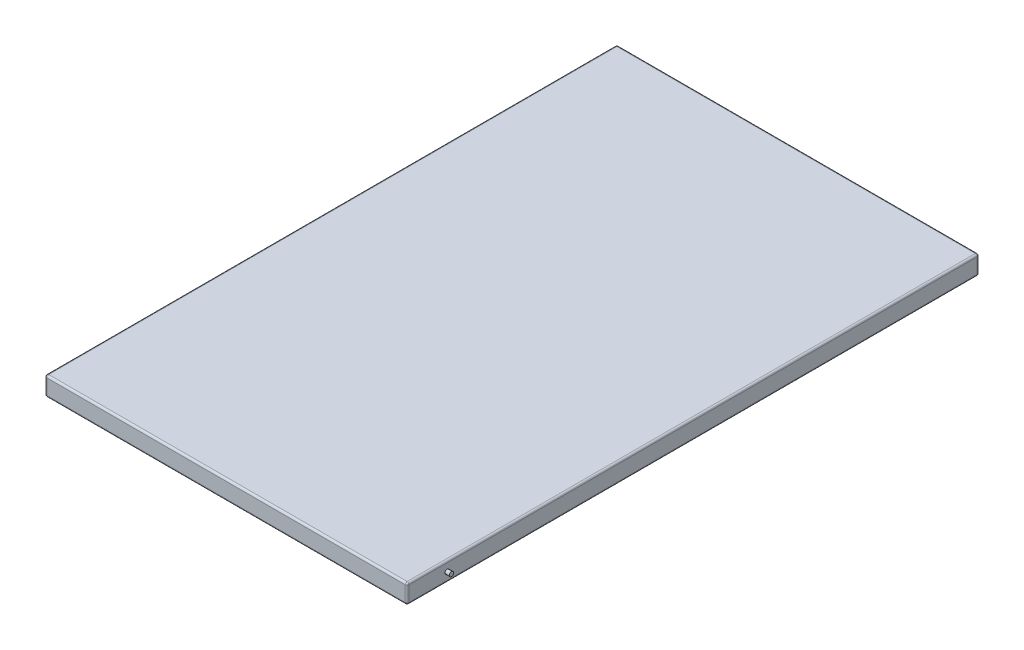
ISO-10303-21;
HEADER;
FILE_DESCRIPTION(('STEP AP214'),'2;1');
FILE_NAME('part.step','',(''),(''),'','','');
FILE_SCHEMA(('AUTOMOTIVE_DESIGN { 1 0 10303 214 1 1 1 1 }'));
ENDSEC;
DATA;
#1=APPLICATION_CONTEXT('core data for automotive mechanical design processes');
#2=APPLICATION_PROTOCOL_DEFINITION('international standard','automotive_design',2000,#1);
#3=PRODUCT_CONTEXT('',#1,'mechanical');
#4=PRODUCT('Part','Part','',(#3));
#5=PRODUCT_RELATED_PRODUCT_CATEGORY('part','',(#4));
#6=PRODUCT_DEFINITION_FORMATION('','',#4);
#7=PRODUCT_DEFINITION_CONTEXT('part definition',#1,'design');
#8=PRODUCT_DEFINITION('design','',#6,#7);
#9=PRODUCT_DEFINITION_SHAPE('','',#8);
#10=(LENGTH_UNIT() NAMED_UNIT(*) SI_UNIT(.MILLI.,.METRE.));
#11=(NAMED_UNIT(*) PLANE_ANGLE_UNIT() SI_UNIT($,.RADIAN.));
#12=(NAMED_UNIT(*) SI_UNIT($,.STERADIAN.) SOLID_ANGLE_UNIT());
#13=UNCERTAINTY_MEASURE_WITH_UNIT(LENGTH_MEASURE(1.E-05),#10,'distance_accuracy_value','');
#14=(GEOMETRIC_REPRESENTATION_CONTEXT(3) GLOBAL_UNCERTAINTY_ASSIGNED_CONTEXT((#13)) GLOBAL_UNIT_ASSIGNED_CONTEXT((#10,
#11,#12)) REPRESENTATION_CONTEXT('',''));
#15=CARTESIAN_POINT('',(0.,0.,0.));
#16=DIRECTION('',(0.,0.,1.));
#17=DIRECTION('',(1.,0.,0.));
#18=AXIS2_PLACEMENT_3D('',#15,#16,#17);
#19=CARTESIAN_POINT('',(-189.999999999999,20.0000000000006,-600.000000000021));
#20=DIRECTION('',(-1.,0.,0.));
#21=DIRECTION('',(0.,0.,1.00000000000004));
#22=AXIS2_PLACEMENT_3D('',#19,#20,#21);
#23=PLANE('',#22);
#24=DIRECTION('',(0.,0.,1.00000000000004));
#25=VECTOR('',#24,1.);
#26=CARTESIAN_POINT('',(-189.999999999999,18.0000000000006,-600.000000000021));
#27=LINE('',#26,#25);
#28=CARTESIAN_POINT('',(-190.,18.0000000000006,-2.));
#29=VERTEX_POINT('',#28);
#30=CARTESIAN_POINT('',(-189.999999999999,18.0000000000006,-598.000000000021));
#31=VERTEX_POINT('',#30);
#32=EDGE_CURVE('E232',#29,#31,#27,.F.);
#33=ORIENTED_EDGE('',*,*,#32,.T.);
#34=DIRECTION('',(0.,-1.00000000000004,0.));
#35=VECTOR('',#34,1.);
#36=CARTESIAN_POINT('',(-189.999999999999,1.66533453693773E-13,-598.000000000021));
#37=LINE('',#36,#35);
#38=CARTESIAN_POINT('',(-189.999999999999,2.00000000000017,-598.000000000021));
#39=VERTEX_POINT('',#38);
#40=EDGE_CURVE('E235',#31,#39,#37,.T.);
#41=ORIENTED_EDGE('',*,*,#40,.T.);
#42=DIRECTION('',(0.,0.,1.00000000000004));
#43=VECTOR('',#42,1.);
#44=CARTESIAN_POINT('',(-189.999999999999,2.00000000000017,-600.000000000021));
#45=LINE('',#44,#43);
#46=CARTESIAN_POINT('',(-190.,2.00000000000017,-2.));
#47=VERTEX_POINT('',#46);
#48=EDGE_CURVE('E216',#39,#47,#45,.T.);
#49=ORIENTED_EDGE('',*,*,#48,.T.);
#50=DIRECTION('',(0.,-1.00000000000004,0.));
#51=VECTOR('',#50,1.);
#52=CARTESIAN_POINT('',(-190.,20.0000000000006,-2.));
#53=LINE('',#52,#51);
#54=EDGE_CURVE('E225',#47,#29,#53,.F.);
#55=ORIENTED_EDGE('',*,*,#54,.T.);
#56=EDGE_LOOP('',(#33,#41,#49,#55));
#57=FACE_BOUND('',#56,.T.);
#58=ADVANCED_FACE('F36',(#57),#23,.T.);
#59=CARTESIAN_POINT('',(190.000000000001,20.0000000000007,-600.000000000021));
#60=DIRECTION('',(0.,1.00000000000004,0.));
#61=DIRECTION('',(-1.,0.,0.));
#62=AXIS2_PLACEMENT_3D('',#59,#60,#61);
#63=PLANE('',#62);
#64=DIRECTION('',(0.,0.,1.00000000000004));
#65=VECTOR('',#64,1.);
#66=CARTESIAN_POINT('',(188.000000000001,20.0000000000007,-600.000000000021));
#67=LINE('',#66,#65);
#68=CARTESIAN_POINT('',(188.,20.0000000000007,-2.));
#69=VERTEX_POINT('',#68);
#70=CARTESIAN_POINT('',(188.000000000001,20.0000000000007,-598.000000000021));
#71=VERTEX_POINT('',#70);
#72=EDGE_CURVE('E159',#69,#71,#67,.F.);
#73=ORIENTED_EDGE('',*,*,#72,.T.);
#74=DIRECTION('',(-1.,0.,0.));
#75=VECTOR('',#74,1.);
#76=CARTESIAN_POINT('',(-189.999999999999,20.0000000000006,-598.000000000021));
#77=LINE('',#76,#75);
#78=CARTESIAN_POINT('',(-187.999999999999,20.0000000000006,-598.000000000021));
#79=VERTEX_POINT('',#78);
#80=EDGE_CURVE('E242',#71,#79,#77,.T.);
#81=ORIENTED_EDGE('',*,*,#80,.T.);
#82=DIRECTION('',(0.,0.,1.00000000000004));
#83=VECTOR('',#82,1.);
#84=CARTESIAN_POINT('',(-187.999999999999,20.0000000000006,-600.000000000021));
#85=LINE('',#84,#83);
#86=CARTESIAN_POINT('',(-188.,20.0000000000006,-2.));
#87=VERTEX_POINT('',#86);
#88=EDGE_CURVE('E240',#79,#87,#85,.T.);
#89=ORIENTED_EDGE('',*,*,#88,.T.);
#90=DIRECTION('',(-1.,0.,0.));
#91=VECTOR('',#90,1.);
#92=CARTESIAN_POINT('',(190.,20.0000000000007,-2.));
#93=LINE('',#92,#91);
#94=EDGE_CURVE('E238',#87,#69,#93,.F.);
#95=ORIENTED_EDGE('',*,*,#94,.T.);
#96=EDGE_LOOP('',(#73,#81,#89,#95));
#97=FACE_BOUND('',#96,.T.);
#98=ADVANCED_FACE('F309',(#97),#63,.T.);
#99=CARTESIAN_POINT('',(190.000000000001,0.,-600.000000000021));
#100=DIRECTION('',(1.,0.,0.));
#101=DIRECTION('',(0.,0.,-1.00000000000004));
#102=AXIS2_PLACEMENT_3D('',#99,#100,#101);
#103=PLANE('',#102);
#104=CARTESIAN_POINT('',(190.,10.0000000000003,-42.0000000000007));
#105=DIRECTION('',(1.,0.,0.));
#106=DIRECTION('',(0.,0.,-1.00000000000004));
#107=AXIS2_PLACEMENT_3D('',#104,#105,#106);
#108=CIRCLE('',#107,2.25);
#109=CARTESIAN_POINT('',(190.,10.0000000000003,-44.2500000000008));
#110=VERTEX_POINT('',#109);
#111=EDGE_CURVE('E292',#110,#110,#108,.T.);
#112=ORIENTED_EDGE('',*,*,#111,.F.);
#113=EDGE_LOOP('',(#112));
#114=FACE_BOUND('',#113,.T.);
#115=DIRECTION('',(0.,0.,1.00000000000004));
#116=VECTOR('',#115,1.);
#117=CARTESIAN_POINT('',(190.000000000001,2.,-600.000000000021));
#118=LINE('',#117,#116);
#119=CARTESIAN_POINT('',(190.,2.,-2.));
#120=VERTEX_POINT('',#119);
#121=CARTESIAN_POINT('',(190.000000000001,2.,-598.000000000021));
#122=VERTEX_POINT('',#121);
#123=EDGE_CURVE('E137',#120,#122,#118,.F.);
#124=ORIENTED_EDGE('',*,*,#123,.T.);
#125=DIRECTION('',(0.,1.00000000000004,0.));
#126=VECTOR('',#125,1.);
#127=CARTESIAN_POINT('',(190.000000000001,20.0000000000007,-598.000000000021));
#128=LINE('',#127,#126);
#129=CARTESIAN_POINT('',(190.000000000001,18.0000000000007,-598.000000000021));
#130=VERTEX_POINT('',#129);
#131=EDGE_CURVE('E133',#122,#130,#128,.T.);
#132=ORIENTED_EDGE('',*,*,#131,.T.);
#133=DIRECTION('',(0.,0.,1.00000000000004));
#134=VECTOR('',#133,1.);
#135=CARTESIAN_POINT('',(190.000000000001,18.0000000000007,-600.000000000021));
#136=LINE('',#135,#134);
#137=CARTESIAN_POINT('',(190.,18.0000000000007,-2.));
#138=VERTEX_POINT('',#137);
#139=EDGE_CURVE('E127',#130,#138,#136,.T.);
#140=ORIENTED_EDGE('',*,*,#139,.T.);
#141=DIRECTION('',(0.,1.00000000000004,0.));
#142=VECTOR('',#141,1.);
#143=CARTESIAN_POINT('',(190.,0.,-2.));
#144=LINE('',#143,#142);
#145=EDGE_CURVE('E130',#138,#120,#144,.F.);
#146=ORIENTED_EDGE('',*,*,#145,.T.);
#147=EDGE_LOOP('',(#124,#132,#140,#146));
#148=FACE_BOUND('',#147,.T.);
#149=ADVANCED_FACE('F129',(#114,#148),#103,.T.);
#150=CARTESIAN_POINT('',(-189.999999999999,1.66533453693773E-13,-600.000000000021));
#151=DIRECTION('',(0.,-1.00000000000004,0.));
#152=DIRECTION('',(0.,0.,-1.00000000000004));
#153=AXIS2_PLACEMENT_3D('',#150,#151,#152);
#154=PLANE('',#153);
#155=DIRECTION('',(0.,0.,1.00000000000004));
#156=VECTOR('',#155,1.);
#157=CARTESIAN_POINT('',(-187.999999999999,0.,-600.000000000021));
#158=LINE('',#157,#156);
#159=CARTESIAN_POINT('',(-188.,0.,-2.));
#160=VERTEX_POINT('',#159);
#161=CARTESIAN_POINT('',(-187.999999999999,0.,-598.000000000021));
#162=VERTEX_POINT('',#161);
#163=EDGE_CURVE('E218',#160,#162,#158,.F.);
#164=ORIENTED_EDGE('',*,*,#163,.T.);
#165=DIRECTION('',(1.,0.,0.));
#166=VECTOR('',#165,1.);
#167=CARTESIAN_POINT('',(190.000000000001,0.,-598.000000000021));
#168=LINE('',#167,#166);
#169=CARTESIAN_POINT('',(188.000000000001,0.,-598.000000000021));
#170=VERTEX_POINT('',#169);
#171=EDGE_CURVE('E222',#162,#170,#168,.T.);
#172=ORIENTED_EDGE('',*,*,#171,.T.);
#173=DIRECTION('',(0.,0.,1.00000000000004));
#174=VECTOR('',#173,1.);
#175=CARTESIAN_POINT('',(188.000000000001,0.,-600.000000000021));
#176=LINE('',#175,#174);
#177=CARTESIAN_POINT('',(188.,0.,-2.));
#178=VERTEX_POINT('',#177);
#179=EDGE_CURVE('E227',#170,#178,#176,.T.);
#180=ORIENTED_EDGE('',*,*,#179,.T.);
#181=DIRECTION('',(1.,0.,0.));
#182=VECTOR('',#181,1.);
#183=CARTESIAN_POINT('',(-190.,1.66533453693773E-13,-2.));
#184=LINE('',#183,#182);
#185=EDGE_CURVE('E223',#178,#160,#184,.F.);
#186=ORIENTED_EDGE('',*,*,#185,.T.);
#187=EDGE_LOOP('',(#164,#172,#180,#186));
#188=FACE_BOUND('',#187,.T.);
#189=ADVANCED_FACE('F308',(#188),#154,.T.);
#190=CARTESIAN_POINT('',(0.,0.,-600.000000000021));
#191=DIRECTION('',(0.,0.,1.00000000000004));
#192=DIRECTION('',(1.,0.,0.));
#193=AXIS2_PLACEMENT_3D('',#190,#191,#192);
#194=PLANE('',#193);
#195=DIRECTION('',(-1.,0.,0.));
#196=VECTOR('',#195,1.);
#197=CARTESIAN_POINT('',(190.000000000001,18.0000000000007,-600.000000000021));
#198=LINE('',#197,#196);
#199=CARTESIAN_POINT('',(-187.999999999999,18.0000000000006,-600.000000000021));
#200=VERTEX_POINT('',#199);
#201=CARTESIAN_POINT('',(188.000000000001,18.0000000000007,-600.000000000021));
#202=VERTEX_POINT('',#201);
#203=EDGE_CURVE('E282',#200,#202,#198,.F.);
#204=ORIENTED_EDGE('',*,*,#203,.T.);
#205=DIRECTION('',(0.,1.00000000000004,0.));
#206=VECTOR('',#205,1.);
#207=CARTESIAN_POINT('',(188.000000000001,0.,-600.000000000021));
#208=LINE('',#207,#206);
#209=CARTESIAN_POINT('',(188.000000000001,2.,-600.000000000021));
#210=VERTEX_POINT('',#209);
#211=EDGE_CURVE('E276',#202,#210,#208,.F.);
#212=ORIENTED_EDGE('',*,*,#211,.T.);
#213=DIRECTION('',(1.,0.,0.));
#214=VECTOR('',#213,1.);
#215=CARTESIAN_POINT('',(-189.999999999999,2.00000000000017,-600.000000000021));
#216=LINE('',#215,#214);
#217=CARTESIAN_POINT('',(-187.999999999999,2.,-600.000000000021));
#218=VERTEX_POINT('',#217);
#219=EDGE_CURVE('E271',#210,#218,#216,.F.);
#220=ORIENTED_EDGE('',*,*,#219,.T.);
#221=DIRECTION('',(0.,-1.00000000000004,0.));
#222=VECTOR('',#221,1.);
#223=CARTESIAN_POINT('',(-187.999999999999,20.0000000000006,-600.000000000021));
#224=LINE('',#223,#222);
#225=EDGE_CURVE('E277',#218,#200,#224,.F.);
#226=ORIENTED_EDGE('',*,*,#225,.T.);
#227=EDGE_LOOP('',(#204,#212,#220,#226));
#228=FACE_BOUND('',#227,.T.);
#229=ADVANCED_FACE('F280',(#228),#194,.F.);
#230=CARTESIAN_POINT('',(0.,0.,0.));
#231=DIRECTION('',(0.,0.,1.00000000000004));
#232=DIRECTION('',(1.,0.,0.));
#233=AXIS2_PLACEMENT_3D('',#230,#231,#232);
#234=PLANE('',#233);
#235=DIRECTION('',(-1.,0.,0.));
#236=VECTOR('',#235,1.);
#237=CARTESIAN_POINT('',(0.,18.0000000000006,0.));
#238=LINE('',#237,#236);
#239=CARTESIAN_POINT('',(188.,18.0000000000007,0.));
#240=VERTEX_POINT('',#239);
#241=CARTESIAN_POINT('',(-188.,18.0000000000006,0.));
#242=VERTEX_POINT('',#241);
#243=EDGE_CURVE('E45',#240,#242,#238,.T.);
#244=ORIENTED_EDGE('',*,*,#243,.T.);
#245=DIRECTION('',(0.,-1.00000000000004,0.));
#246=VECTOR('',#245,1.);
#247=CARTESIAN_POINT('',(-188.,0.,0.));
#248=LINE('',#247,#246);
#249=CARTESIAN_POINT('',(-188.,2.,0.));
#250=VERTEX_POINT('',#249);
#251=EDGE_CURVE('E11',#242,#250,#248,.T.);
#252=ORIENTED_EDGE('',*,*,#251,.T.);
#253=DIRECTION('',(1.,0.,0.));
#254=VECTOR('',#253,1.);
#255=CARTESIAN_POINT('',(0.,2.,0.));
#256=LINE('',#255,#254);
#257=CARTESIAN_POINT('',(188.,2.,0.));
#258=VERTEX_POINT('',#257);
#259=EDGE_CURVE('E59',#250,#258,#256,.T.);
#260=ORIENTED_EDGE('',*,*,#259,.T.);
#261=DIRECTION('',(0.,1.00000000000004,0.));
#262=VECTOR('',#261,1.);
#263=CARTESIAN_POINT('',(188.,0.,0.));
#264=LINE('',#263,#262);
#265=EDGE_CURVE('E245',#258,#240,#264,.T.);
#266=ORIENTED_EDGE('',*,*,#265,.T.);
#267=EDGE_LOOP('',(#244,#252,#260,#266));
#268=FACE_BOUND('',#267,.T.);
#269=ADVANCED_FACE('F383',(#268),#234,.T.);
#270=CARTESIAN_POINT('',(-188.,0.,-2.));
#271=DIRECTION('',(0.,-1.00000000000004,0.));
#272=DIRECTION('',(0.,0.,-1.00000000000004));
#273=AXIS2_PLACEMENT_3D('',#270,#271,#272);
#274=CYLINDRICAL_SURFACE('',#273,2.);
#275=CARTESIAN_POINT('',(-188.,2.,-2.));
#276=DIRECTION('',(0.,-1.00000000000004,0.));
#277=DIRECTION('',(1.,0.,0.));
#278=AXIS2_PLACEMENT_3D('',#275,#276,#277);
#279=CIRCLE('',#278,2.);
#280=EDGE_CURVE('E40',#250,#47,#279,.T.);
#281=ORIENTED_EDGE('',*,*,#280,.F.);
#282=ORIENTED_EDGE('',*,*,#251,.F.);
#283=CARTESIAN_POINT('',(-188.,18.0000000000006,-2.));
#284=DIRECTION('',(0.,1.00000000000004,0.));
#285=DIRECTION('',(0.,0.,1.00000000000004));
#286=AXIS2_PLACEMENT_3D('',#283,#284,#285);
#287=CIRCLE('',#286,2.);
#288=EDGE_CURVE('E198',#29,#242,#287,.T.);
#289=ORIENTED_EDGE('',*,*,#288,.F.);
#290=ORIENTED_EDGE('',*,*,#54,.F.);
#291=EDGE_LOOP('',(#281,#282,#289,#290));
#292=FACE_BOUND('',#291,.T.);
#293=ADVANCED_FACE('F38',(#292),#274,.T.);
#294=CARTESIAN_POINT('',(-188.,2.,-2.));
#295=DIRECTION('',(-1.,0.,0.));
#296=DIRECTION('',(0.,-1.00000000000004,0.));
#297=AXIS2_PLACEMENT_3D('',#294,#295,#296);
#298=SPHERICAL_SURFACE('',#297,2.);
#299=CARTESIAN_POINT('',(-188.,2.,-2.));
#300=DIRECTION('',(-1.,0.,0.));
#301=DIRECTION('',(0.,0.,1.00000000000004));
#302=AXIS2_PLACEMENT_3D('',#299,#300,#301);
#303=CIRCLE('',#302,2.);
#304=EDGE_CURVE('E194',#250,#160,#303,.F.);
#305=ORIENTED_EDGE('',*,*,#304,.F.);
#306=ORIENTED_EDGE('',*,*,#280,.T.);
#307=CARTESIAN_POINT('',(-188.,2.,-2.));
#308=DIRECTION('',(0.,0.,1.00000000000004));
#309=DIRECTION('',(1.,0.,0.));
#310=AXIS2_PLACEMENT_3D('',#307,#308,#309);
#311=CIRCLE('',#310,2.);
#312=EDGE_CURVE('E196',#160,#47,#311,.F.);
#313=ORIENTED_EDGE('',*,*,#312,.F.);
#314=EDGE_LOOP('',(#305,#306,#313));
#315=FACE_BOUND('',#314,.T.);
#316=ADVANCED_FACE('F208',(#315),#298,.T.);
#317=CARTESIAN_POINT('',(-188.,18.0000000000006,-2.));
#318=DIRECTION('',(0.,0.,1.00000000000004));
#319=DIRECTION('',(1.,0.,0.));
#320=AXIS2_PLACEMENT_3D('',#317,#318,#319);
#321=SPHERICAL_SURFACE('',#320,2.);
#322=CARTESIAN_POINT('',(-188.,18.0000000000006,-2.));
#323=DIRECTION('',(0.,0.,1.00000000000004));
#324=DIRECTION('',(1.,0.,0.));
#325=AXIS2_PLACEMENT_3D('',#322,#323,#324);
#326=CIRCLE('',#325,2.);
#327=EDGE_CURVE('E188',#29,#87,#326,.F.);
#328=ORIENTED_EDGE('',*,*,#327,.F.);
#329=ORIENTED_EDGE('',*,*,#288,.T.);
#330=CARTESIAN_POINT('',(-188.,18.0000000000006,-2.));
#331=DIRECTION('',(-1.,0.,0.));
#332=DIRECTION('',(0.,0.,1.00000000000004));
#333=AXIS2_PLACEMENT_3D('',#330,#331,#332);
#334=CIRCLE('',#333,2.);
#335=EDGE_CURVE('E191',#87,#242,#334,.F.);
#336=ORIENTED_EDGE('',*,*,#335,.F.);
#337=EDGE_LOOP('',(#328,#329,#336));
#338=FACE_BOUND('',#337,.T.);
#339=ADVANCED_FACE('F377',(#338),#321,.T.);
#340=CARTESIAN_POINT('',(-187.999999999999,2.,-600.000000000021));
#341=DIRECTION('',(0.,0.,1.00000000000004));
#342=DIRECTION('',(1.,0.,0.));
#343=AXIS2_PLACEMENT_3D('',#340,#341,#342);
#344=CYLINDRICAL_SURFACE('',#343,2.);
#345=ORIENTED_EDGE('',*,*,#312,.T.);
#346=ORIENTED_EDGE('',*,*,#48,.F.);
#347=CARTESIAN_POINT('',(-187.999999999999,2.,-598.000000000021));
#348=DIRECTION('',(0.,0.,-1.00000000000004));
#349=DIRECTION('',(-1.,0.,0.));
#350=AXIS2_PLACEMENT_3D('',#347,#348,#349);
#351=CIRCLE('',#350,2.);
#352=EDGE_CURVE('E183',#162,#39,#351,.T.);
#353=ORIENTED_EDGE('',*,*,#352,.F.);
#354=ORIENTED_EDGE('',*,*,#163,.F.);
#355=EDGE_LOOP('',(#345,#346,#353,#354));
#356=FACE_BOUND('',#355,.T.);
#357=ADVANCED_FACE('F214',(#356),#344,.T.);
#358=CARTESIAN_POINT('',(0.,2.,-2.));
#359=DIRECTION('',(1.,0.,0.));
#360=DIRECTION('',(0.,0.,-1.00000000000004));
#361=AXIS2_PLACEMENT_3D('',#358,#359,#360);
#362=CYLINDRICAL_SURFACE('',#361,2.);
#363=ORIENTED_EDGE('',*,*,#304,.T.);
#364=ORIENTED_EDGE('',*,*,#185,.F.);
#365=CARTESIAN_POINT('',(188.,2.,-2.));
#366=DIRECTION('',(1.,0.,0.));
#367=DIRECTION('',(0.,0.,-1.00000000000004));
#368=AXIS2_PLACEMENT_3D('',#365,#366,#367);
#369=CIRCLE('',#368,2.);
#370=EDGE_CURVE('E180',#258,#178,#369,.T.);
#371=ORIENTED_EDGE('',*,*,#370,.F.);
#372=ORIENTED_EDGE('',*,*,#259,.F.);
#373=EDGE_LOOP('',(#363,#364,#371,#372));
#374=FACE_BOUND('',#373,.T.);
#375=ADVANCED_FACE('F372',(#374),#362,.T.);
#376=CARTESIAN_POINT('',(188.,0.,-2.));
#377=DIRECTION('',(0.,1.00000000000004,0.));
#378=DIRECTION('',(0.,0.,1.00000000000004));
#379=AXIS2_PLACEMENT_3D('',#376,#377,#378);
#380=CYLINDRICAL_SURFACE('',#379,2.);
#381=CARTESIAN_POINT('',(188.,18.0000000000007,-2.));
#382=DIRECTION('',(0.,1.00000000000004,0.));
#383=DIRECTION('',(0.,0.,1.00000000000004));
#384=AXIS2_PLACEMENT_3D('',#381,#382,#383);
#385=CIRCLE('',#384,2.);
#386=EDGE_CURVE('E144',#240,#138,#385,.T.);
#387=ORIENTED_EDGE('',*,*,#386,.F.);
#388=ORIENTED_EDGE('',*,*,#265,.F.);
#389=CARTESIAN_POINT('',(188.,2.,-2.));
#390=DIRECTION('',(0.,-1.00000000000004,0.));
#391=DIRECTION('',(0.,0.,-1.00000000000004));
#392=AXIS2_PLACEMENT_3D('',#389,#390,#391);
#393=CIRCLE('',#392,2.);
#394=EDGE_CURVE('E147',#120,#258,#393,.T.);
#395=ORIENTED_EDGE('',*,*,#394,.F.);
#396=ORIENTED_EDGE('',*,*,#145,.F.);
#397=EDGE_LOOP('',(#387,#388,#395,#396));
#398=FACE_BOUND('',#397,.T.);
#399=ADVANCED_FACE('F142',(#398),#380,.T.);
#400=CARTESIAN_POINT('',(0.,18.0000000000006,-2.));
#401=DIRECTION('',(-1.,0.,0.));
#402=DIRECTION('',(0.,-1.00000000000004,0.));
#403=AXIS2_PLACEMENT_3D('',#400,#401,#402);
#404=CYLINDRICAL_SURFACE('',#403,2.);
#405=ORIENTED_EDGE('',*,*,#335,.T.);
#406=ORIENTED_EDGE('',*,*,#243,.F.);
#407=CARTESIAN_POINT('',(188.,18.0000000000007,-2.));
#408=DIRECTION('',(1.,0.,0.));
#409=DIRECTION('',(0.,0.,-1.00000000000004));
#410=AXIS2_PLACEMENT_3D('',#407,#408,#409);
#411=CIRCLE('',#410,2.);
#412=EDGE_CURVE('E156',#69,#240,#411,.T.);
#413=ORIENTED_EDGE('',*,*,#412,.F.);
#414=ORIENTED_EDGE('',*,*,#94,.F.);
#415=EDGE_LOOP('',(#405,#406,#413,#414));
#416=FACE_BOUND('',#415,.T.);
#417=ADVANCED_FACE('F365',(#416),#404,.T.);
#418=CARTESIAN_POINT('',(-187.999999999999,18.0000000000006,-600.000000000021));
#419=DIRECTION('',(0.,0.,1.00000000000004));
#420=DIRECTION('',(1.,0.,0.));
#421=AXIS2_PLACEMENT_3D('',#418,#419,#420);
#422=CYLINDRICAL_SURFACE('',#421,2.);
#423=ORIENTED_EDGE('',*,*,#327,.T.);
#424=ORIENTED_EDGE('',*,*,#88,.F.);
#425=CARTESIAN_POINT('',(-187.999999999999,18.0000000000006,-598.000000000021));
#426=DIRECTION('',(0.,0.,-1.00000000000004));
#427=DIRECTION('',(-1.,0.,0.));
#428=AXIS2_PLACEMENT_3D('',#425,#426,#427);
#429=CIRCLE('',#428,2.);
#430=EDGE_CURVE('E175',#31,#79,#429,.T.);
#431=ORIENTED_EDGE('',*,*,#430,.F.);
#432=ORIENTED_EDGE('',*,*,#32,.F.);
#433=EDGE_LOOP('',(#423,#424,#431,#432));
#434=FACE_BOUND('',#433,.T.);
#435=ADVANCED_FACE('F361',(#434),#422,.T.);
#436=CARTESIAN_POINT('',(-187.999999999999,20.0000000000006,-598.000000000021));
#437=DIRECTION('',(0.,1.00000000000004,0.));
#438=DIRECTION('',(0.,0.,1.00000000000004));
#439=AXIS2_PLACEMENT_3D('',#436,#437,#438);
#440=CYLINDRICAL_SURFACE('',#439,2.);
#441=CARTESIAN_POINT('',(-187.999999999999,2.,-598.000000000021));
#442=DIRECTION('',(0.,-1.00000000000004,0.));
#443=DIRECTION('',(0.,0.,-1.00000000000004));
#444=AXIS2_PLACEMENT_3D('',#441,#442,#443);
#445=CIRCLE('',#444,2.);
#446=EDGE_CURVE('E185',#39,#218,#445,.T.);
#447=ORIENTED_EDGE('',*,*,#446,.F.);
#448=ORIENTED_EDGE('',*,*,#40,.F.);
#449=CARTESIAN_POINT('',(-187.999999999999,18.0000000000006,-598.000000000021));
#450=DIRECTION('',(0.,1.00000000000004,0.));
#451=DIRECTION('',(0.,0.,1.00000000000004));
#452=AXIS2_PLACEMENT_3D('',#449,#450,#451);
#453=CIRCLE('',#452,2.);
#454=EDGE_CURVE('E172',#200,#31,#453,.T.);
#455=ORIENTED_EDGE('',*,*,#454,.F.);
#456=ORIENTED_EDGE('',*,*,#225,.F.);
#457=EDGE_LOOP('',(#447,#448,#455,#456));
#458=FACE_BOUND('',#457,.T.);
#459=ADVANCED_FACE('F357',(#458),#440,.T.);
#460=CARTESIAN_POINT('',(-187.999999999999,2.,-598.000000000021));
#461=DIRECTION('',(-1.,0.,0.));
#462=DIRECTION('',(0.,-1.00000000000004,0.));
#463=AXIS2_PLACEMENT_3D('',#460,#461,#462);
#464=SPHERICAL_SURFACE('',#463,2.);
#465=ORIENTED_EDGE('',*,*,#352,.T.);
#466=ORIENTED_EDGE('',*,*,#446,.T.);
#467=CARTESIAN_POINT('',(-187.999999999999,2.,-598.000000000021));
#468=DIRECTION('',(-1.,0.,0.));
#469=DIRECTION('',(0.,0.,1.00000000000004));
#470=AXIS2_PLACEMENT_3D('',#467,#468,#469);
#471=CIRCLE('',#470,2.);
#472=EDGE_CURVE('E164',#162,#218,#471,.F.);
#473=ORIENTED_EDGE('',*,*,#472,.F.);
#474=EDGE_LOOP('',(#465,#466,#473));
#475=FACE_BOUND('',#474,.T.);
#476=ADVANCED_FACE('F353',(#475),#464,.T.);
#477=CARTESIAN_POINT('',(188.,2.,-2.));
#478=DIRECTION('',(0.,0.,1.00000000000004));
#479=DIRECTION('',(1.,0.,0.));
#480=AXIS2_PLACEMENT_3D('',#477,#478,#479);
#481=SPHERICAL_SURFACE('',#480,2.);
#482=ORIENTED_EDGE('',*,*,#394,.T.);
#483=ORIENTED_EDGE('',*,*,#370,.T.);
#484=CARTESIAN_POINT('',(188.,2.,-2.));
#485=DIRECTION('',(0.,0.,1.00000000000004));
#486=DIRECTION('',(1.,0.,0.));
#487=AXIS2_PLACEMENT_3D('',#484,#485,#486);
#488=CIRCLE('',#487,2.);
#489=EDGE_CURVE('E160',#120,#178,#488,.F.);
#490=ORIENTED_EDGE('',*,*,#489,.F.);
#491=EDGE_LOOP('',(#482,#483,#490));
#492=FACE_BOUND('',#491,.T.);
#493=ADVANCED_FACE('F350',(#492),#481,.T.);
#494=CARTESIAN_POINT('',(188.,18.0000000000007,-2.));
#495=DIRECTION('',(0.,0.,1.00000000000004));
#496=DIRECTION('',(1.,0.,0.));
#497=AXIS2_PLACEMENT_3D('',#494,#495,#496);
#498=SPHERICAL_SURFACE('',#497,2.);
#499=ORIENTED_EDGE('',*,*,#412,.T.);
#500=ORIENTED_EDGE('',*,*,#386,.T.);
#501=CARTESIAN_POINT('',(188.,18.0000000000007,-2.));
#502=DIRECTION('',(0.,0.,1.00000000000004));
#503=DIRECTION('',(1.,0.,0.));
#504=AXIS2_PLACEMENT_3D('',#501,#502,#503);
#505=CIRCLE('',#504,2.);
#506=EDGE_CURVE('E153',#69,#138,#505,.F.);
#507=ORIENTED_EDGE('',*,*,#506,.F.);
#508=EDGE_LOOP('',(#499,#500,#507));
#509=FACE_BOUND('',#508,.T.);
#510=ADVANCED_FACE('F152',(#509),#498,.T.);
#511=CARTESIAN_POINT('',(-187.999999999999,18.0000000000006,-598.000000000021));
#512=DIRECTION('',(-1.,0.,0.));
#513=DIRECTION('',(0.,0.,1.00000000000004));
#514=AXIS2_PLACEMENT_3D('',#511,#512,#513);
#515=SPHERICAL_SURFACE('',#514,2.);
#516=ORIENTED_EDGE('',*,*,#454,.T.);
#517=ORIENTED_EDGE('',*,*,#430,.T.);
#518=CARTESIAN_POINT('',(-187.999999999999,18.0000000000006,-598.000000000021));
#519=DIRECTION('',(-1.,0.,0.));
#520=DIRECTION('',(0.,0.,1.00000000000004));
#521=AXIS2_PLACEMENT_3D('',#518,#519,#520);
#522=CIRCLE('',#521,2.);
#523=EDGE_CURVE('E161',#200,#79,#522,.F.);
#524=ORIENTED_EDGE('',*,*,#523,.F.);
#525=EDGE_LOOP('',(#516,#517,#524));
#526=FACE_BOUND('',#525,.T.);
#527=ADVANCED_FACE('F344',(#526),#515,.T.);
#528=CARTESIAN_POINT('',(-189.999999999999,2.00000000000017,-598.000000000021));
#529=DIRECTION('',(-1.,0.,0.));
#530=DIRECTION('',(0.,0.,1.00000000000004));
#531=AXIS2_PLACEMENT_3D('',#528,#529,#530);
#532=CYLINDRICAL_SURFACE('',#531,2.);
#533=ORIENTED_EDGE('',*,*,#472,.T.);
#534=ORIENTED_EDGE('',*,*,#219,.F.);
#535=CARTESIAN_POINT('',(188.000000000001,2.,-598.000000000021));
#536=DIRECTION('',(1.,0.,0.));
#537=DIRECTION('',(0.,0.,-1.00000000000004));
#538=AXIS2_PLACEMENT_3D('',#535,#536,#537);
#539=CIRCLE('',#538,2.);
#540=EDGE_CURVE('E166',#170,#210,#539,.T.);
#541=ORIENTED_EDGE('',*,*,#540,.F.);
#542=ORIENTED_EDGE('',*,*,#171,.F.);
#543=EDGE_LOOP('',(#533,#534,#541,#542));
#544=FACE_BOUND('',#543,.T.);
#545=ADVANCED_FACE('F273',(#544),#532,.T.);
#546=CARTESIAN_POINT('',(188.000000000001,2.,-600.000000000021));
#547=DIRECTION('',(0.,0.,1.00000000000004));
#548=DIRECTION('',(1.,0.,0.));
#549=AXIS2_PLACEMENT_3D('',#546,#547,#548);
#550=CYLINDRICAL_SURFACE('',#549,2.);
#551=ORIENTED_EDGE('',*,*,#489,.T.);
#552=ORIENTED_EDGE('',*,*,#179,.F.);
#553=CARTESIAN_POINT('',(188.000000000001,2.,-598.000000000021));
#554=DIRECTION('',(0.,0.,-1.00000000000004));
#555=DIRECTION('',(-1.,0.,0.));
#556=AXIS2_PLACEMENT_3D('',#553,#554,#555);
#557=CIRCLE('',#556,2.);
#558=EDGE_CURVE('E260',#122,#170,#557,.T.);
#559=ORIENTED_EDGE('',*,*,#558,.F.);
#560=ORIENTED_EDGE('',*,*,#123,.F.);
#561=EDGE_LOOP('',(#551,#552,#559,#560));
#562=FACE_BOUND('',#561,.T.);
#563=ADVANCED_FACE('F338',(#562),#550,.T.);
#564=CARTESIAN_POINT('',(188.000000000001,18.0000000000007,-600.000000000021));
#565=DIRECTION('',(0.,0.,1.00000000000004));
#566=DIRECTION('',(1.,0.,0.));
#567=AXIS2_PLACEMENT_3D('',#564,#565,#566);
#568=CYLINDRICAL_SURFACE('',#567,2.);
#569=ORIENTED_EDGE('',*,*,#506,.T.);
#570=ORIENTED_EDGE('',*,*,#139,.F.);
#571=CARTESIAN_POINT('',(188.000000000001,18.0000000000007,-598.000000000021));
#572=DIRECTION('',(0.,0.,-1.00000000000004));
#573=DIRECTION('',(-1.,0.,0.));
#574=AXIS2_PLACEMENT_3D('',#571,#572,#573);
#575=CIRCLE('',#574,2.);
#576=EDGE_CURVE('E257',#71,#130,#575,.T.);
#577=ORIENTED_EDGE('',*,*,#576,.F.);
#578=ORIENTED_EDGE('',*,*,#72,.F.);
#579=EDGE_LOOP('',(#569,#570,#577,#578));
#580=FACE_BOUND('',#579,.T.);
#581=ADVANCED_FACE('F158',(#580),#568,.T.);
#582=CARTESIAN_POINT('',(190.000000000001,18.0000000000007,-598.000000000021));
#583=DIRECTION('',(1.,0.,0.));
#584=DIRECTION('',(0.,1.00000000000004,0.));
#585=AXIS2_PLACEMENT_3D('',#582,#583,#584);
#586=CYLINDRICAL_SURFACE('',#585,2.);
#587=ORIENTED_EDGE('',*,*,#523,.T.);
#588=ORIENTED_EDGE('',*,*,#80,.F.);
#589=CARTESIAN_POINT('',(188.000000000001,18.0000000000007,-598.000000000021));
#590=DIRECTION('',(1.,0.,0.));
#591=DIRECTION('',(0.,0.,-1.00000000000004));
#592=AXIS2_PLACEMENT_3D('',#589,#590,#591);
#593=CIRCLE('',#592,2.);
#594=EDGE_CURVE('E254',#202,#71,#593,.T.);
#595=ORIENTED_EDGE('',*,*,#594,.F.);
#596=ORIENTED_EDGE('',*,*,#203,.F.);
#597=EDGE_LOOP('',(#587,#588,#595,#596));
#598=FACE_BOUND('',#597,.T.);
#599=ADVANCED_FACE('F332',(#598),#586,.T.);
#600=CARTESIAN_POINT('',(188.000000000001,2.,-598.000000000021));
#601=DIRECTION('',(0.,-1.00000000000004,0.));
#602=DIRECTION('',(0.,0.,-1.00000000000004));
#603=AXIS2_PLACEMENT_3D('',#600,#601,#602);
#604=SPHERICAL_SURFACE('',#603,2.);
#605=ORIENTED_EDGE('',*,*,#558,.T.);
#606=ORIENTED_EDGE('',*,*,#540,.T.);
#607=CARTESIAN_POINT('',(188.000000000001,2.,-598.000000000021));
#608=DIRECTION('',(0.,-1.00000000000004,0.));
#609=DIRECTION('',(0.,0.,-1.00000000000004));
#610=AXIS2_PLACEMENT_3D('',#607,#608,#609);
#611=CIRCLE('',#610,2.);
#612=EDGE_CURVE('E251',#122,#210,#611,.F.);
#613=ORIENTED_EDGE('',*,*,#612,.F.);
#614=EDGE_LOOP('',(#605,#606,#613));
#615=FACE_BOUND('',#614,.T.);
#616=ADVANCED_FACE('F266',(#615),#604,.T.);
#617=CARTESIAN_POINT('',(188.000000000001,18.0000000000007,-598.000000000021));
#618=DIRECTION('',(0.,1.00000000000004,0.));
#619=DIRECTION('',(0.,0.,1.00000000000004));
#620=AXIS2_PLACEMENT_3D('',#617,#618,#619);
#621=SPHERICAL_SURFACE('',#620,2.);
#622=ORIENTED_EDGE('',*,*,#594,.T.);
#623=ORIENTED_EDGE('',*,*,#576,.T.);
#624=CARTESIAN_POINT('',(188.000000000001,18.0000000000007,-598.000000000021));
#625=DIRECTION('',(0.,1.00000000000004,0.));
#626=DIRECTION('',(0.,0.,1.00000000000004));
#627=AXIS2_PLACEMENT_3D('',#624,#625,#626);
#628=CIRCLE('',#627,2.);
#629=EDGE_CURVE('E249',#202,#130,#628,.F.);
#630=ORIENTED_EDGE('',*,*,#629,.F.);
#631=EDGE_LOOP('',(#622,#623,#630));
#632=FACE_BOUND('',#631,.T.);
#633=ADVANCED_FACE('F326',(#632),#621,.T.);
#634=CARTESIAN_POINT('',(188.000000000001,0.,-598.000000000021));
#635=DIRECTION('',(0.,-1.00000000000004,0.));
#636=DIRECTION('',(0.,0.,-1.00000000000004));
#637=AXIS2_PLACEMENT_3D('',#634,#635,#636);
#638=CYLINDRICAL_SURFACE('',#637,2.);
#639=ORIENTED_EDGE('',*,*,#612,.T.);
#640=ORIENTED_EDGE('',*,*,#211,.F.);
#641=ORIENTED_EDGE('',*,*,#629,.T.);
#642=ORIENTED_EDGE('',*,*,#131,.F.);
#643=EDGE_LOOP('',(#639,#640,#641,#642));
#644=FACE_BOUND('',#643,.T.);
#645=ADVANCED_FACE('F303',(#644),#638,.T.);
#646=CARTESIAN_POINT('',(194.5,10.0000000000005,-42.0000000000007));
#647=DIRECTION('',(-1.,0.,0.));
#648=DIRECTION('',(0.,0.,1.00000000000004));
#649=AXIS2_PLACEMENT_3D('',#646,#647,#648);
#650=CYLINDRICAL_SURFACE('',#649,2.25);
#651=CARTESIAN_POINT('',(194.5,10.0000000000005,-42.0000000000007));
#652=DIRECTION('',(1.,0.,0.));
#653=DIRECTION('',(0.,0.,-1.00000000000004));
#654=AXIS2_PLACEMENT_3D('',#651,#652,#653);
#655=CIRCLE('',#654,2.25);
#656=CARTESIAN_POINT('',(194.5,10.0000000000005,-44.2500000000008));
#657=VERTEX_POINT('',#656);
#658=EDGE_CURVE('E252',#657,#657,#655,.T.);
#659=ORIENTED_EDGE('',*,*,#658,.F.);
#660=EDGE_LOOP('',(#659));
#661=FACE_BOUND('',#660,.T.);
#662=ORIENTED_EDGE('',*,*,#111,.T.);
#663=EDGE_LOOP('',(#662));
#664=FACE_BOUND('',#663,.T.);
#665=ADVANCED_FACE('F300',(#661,#664),#650,.T.);
#666=CARTESIAN_POINT('',(194.5,10.0000000000005,-42.0000000000007));
#667=DIRECTION('',(1.,0.,0.));
#668=DIRECTION('',(0.,0.,-1.00000000000004));
#669=AXIS2_PLACEMENT_3D('',#666,#667,#668);
#670=PLANE('',#669);
#671=ORIENTED_EDGE('',*,*,#658,.T.);
#672=EDGE_LOOP('',(#671));
#673=FACE_BOUND('',#672,.T.);
#674=ADVANCED_FACE('F298',(#673),#670,.T.);
#675=CLOSED_SHELL('',(#58,#98,#149,#189,#229,#269,#293,#316,#339,#357,#375,#399,#417,#435,#459,
#476,#493,#510,#527,#545,#563,#581,#599,#616,#633,#645,#665,#674));
#676=MANIFOLD_SOLID_BREP('B2',#675);
#677=ADVANCED_BREP_SHAPE_REPRESENTATION('',(#18,#676),#14);
#678=SHAPE_DEFINITION_REPRESENTATION(#9,#677);
ENDSEC;
END-ISO-10303-21;
